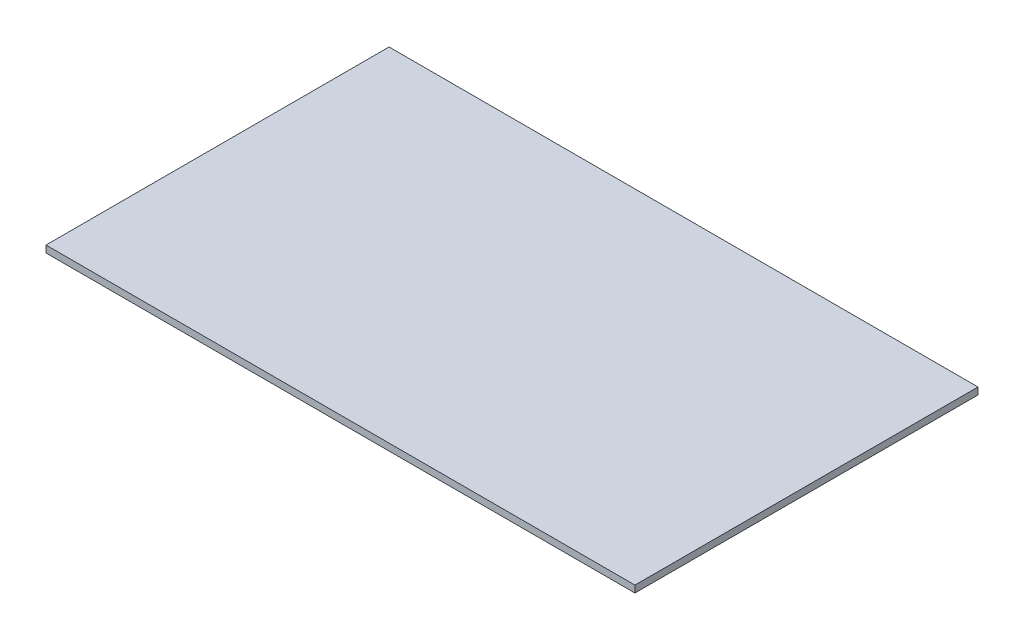
ISO-10303-21;
HEADER;
FILE_DESCRIPTION(('STEP AP214'),'2;1');
FILE_NAME('part.step','',(''),(''),'','','');
FILE_SCHEMA(('AUTOMOTIVE_DESIGN { 1 0 10303 214 1 1 1 1 }'));
ENDSEC;
DATA;
#1=APPLICATION_CONTEXT('core data for automotive mechanical design processes');
#2=APPLICATION_PROTOCOL_DEFINITION('international standard','automotive_design',2000,#1);
#3=PRODUCT_CONTEXT('',#1,'mechanical');
#4=PRODUCT('Part','Part','',(#3));
#5=PRODUCT_RELATED_PRODUCT_CATEGORY('part','',(#4));
#6=PRODUCT_DEFINITION_FORMATION('','',#4);
#7=PRODUCT_DEFINITION_CONTEXT('part definition',#1,'design');
#8=PRODUCT_DEFINITION('design','',#6,#7);
#9=PRODUCT_DEFINITION_SHAPE('','',#8);
#10=(LENGTH_UNIT() NAMED_UNIT(*) SI_UNIT(.MILLI.,.METRE.));
#11=(NAMED_UNIT(*) PLANE_ANGLE_UNIT() SI_UNIT($,.RADIAN.));
#12=(NAMED_UNIT(*) SI_UNIT($,.STERADIAN.) SOLID_ANGLE_UNIT());
#13=UNCERTAINTY_MEASURE_WITH_UNIT(LENGTH_MEASURE(1.E-05),#10,'distance_accuracy_value','');
#14=(GEOMETRIC_REPRESENTATION_CONTEXT(3) GLOBAL_UNCERTAINTY_ASSIGNED_CONTEXT((#13)) GLOBAL_UNIT_ASSIGNED_CONTEXT((#10,
#11,#12)) REPRESENTATION_CONTEXT('',''));
#15=CARTESIAN_POINT('',(0.,0.,0.));
#16=DIRECTION('',(0.,0.,1.));
#17=DIRECTION('',(1.,0.,0.));
#18=AXIS2_PLACEMENT_3D('',#15,#16,#17);
#19=CARTESIAN_POINT('',(0.,0.,149.));
#20=DIRECTION('',(1.,0.,0.));
#21=DIRECTION('',(0.,0.,-1.));
#22=AXIS2_PLACEMENT_3D('',#19,#20,#21);
#23=PLANE('',#22);
#24=DIRECTION('',(0.,-1.,0.));
#25=VECTOR('',#24,1.);
#26=CARTESIAN_POINT('',(0.,0.,0.));
#27=LINE('',#26,#25);
#28=CARTESIAN_POINT('',(0.,3.,0.));
#29=VERTEX_POINT('',#28);
#30=CARTESIAN_POINT('',(0.,0.,0.));
#31=VERTEX_POINT('',#30);
#32=EDGE_CURVE('E113',#29,#31,#27,.T.);
#33=ORIENTED_EDGE('',*,*,#32,.T.);
#34=DIRECTION('',(0.,0.,-1.));
#35=VECTOR('',#34,1.);
#36=CARTESIAN_POINT('',(0.,0.,149.));
#37=LINE('',#36,#35);
#38=CARTESIAN_POINT('',(0.,0.,149.));
#39=VERTEX_POINT('',#38);
#40=EDGE_CURVE('E11',#39,#31,#37,.T.);
#41=ORIENTED_EDGE('',*,*,#40,.F.);
#42=DIRECTION('',(0.,-1.,0.));
#43=VECTOR('',#42,1.);
#44=CARTESIAN_POINT('',(0.,0.,149.));
#45=LINE('',#44,#43);
#46=CARTESIAN_POINT('',(0.,3.,149.));
#47=VERTEX_POINT('',#46);
#48=EDGE_CURVE('E100',#47,#39,#45,.T.);
#49=ORIENTED_EDGE('',*,*,#48,.F.);
#50=DIRECTION('',(0.,0.,-1.));
#51=VECTOR('',#50,1.);
#52=CARTESIAN_POINT('',(0.,3.,149.));
#53=LINE('',#52,#51);
#54=EDGE_CURVE('E112',#47,#29,#53,.T.);
#55=ORIENTED_EDGE('',*,*,#54,.T.);
#56=EDGE_LOOP('',(#33,#41,#49,#55));
#57=FACE_BOUND('',#56,.T.);
#58=ADVANCED_FACE('F44',(#57),#23,.F.);
#59=CARTESIAN_POINT('',(0.,0.,149.));
#60=DIRECTION('',(0.,1.,0.));
#61=DIRECTION('',(0.,0.,1.));
#62=AXIS2_PLACEMENT_3D('',#59,#60,#61);
#63=PLANE('',#62);
#64=DIRECTION('',(1.,0.,0.));
#65=VECTOR('',#64,1.);
#66=CARTESIAN_POINT('',(0.,0.,0.));
#67=LINE('',#66,#65);
#68=CARTESIAN_POINT('',(255.8,0.,0.));
#69=VERTEX_POINT('',#68);
#70=EDGE_CURVE('E105',#31,#69,#67,.T.);
#71=ORIENTED_EDGE('',*,*,#70,.T.);
#72=DIRECTION('',(0.,0.,-1.));
#73=VECTOR('',#72,1.);
#74=CARTESIAN_POINT('',(255.8,0.,149.));
#75=LINE('',#74,#73);
#76=CARTESIAN_POINT('',(255.8,0.,149.));
#77=VERTEX_POINT('',#76);
#78=EDGE_CURVE('E53',#77,#69,#75,.T.);
#79=ORIENTED_EDGE('',*,*,#78,.F.);
#80=DIRECTION('',(1.,0.,0.));
#81=VECTOR('',#80,1.);
#82=CARTESIAN_POINT('',(0.,0.,149.));
#83=LINE('',#82,#81);
#84=EDGE_CURVE('E95',#39,#77,#83,.T.);
#85=ORIENTED_EDGE('',*,*,#84,.F.);
#86=ORIENTED_EDGE('',*,*,#40,.T.);
#87=EDGE_LOOP('',(#71,#79,#85,#86));
#88=FACE_BOUND('',#87,.T.);
#89=ADVANCED_FACE('F101',(#88),#63,.F.);
#90=CARTESIAN_POINT('',(255.8,0.,149.));
#91=DIRECTION('',(-1.,0.,0.));
#92=DIRECTION('',(0.,0.,1.));
#93=AXIS2_PLACEMENT_3D('',#90,#91,#92);
#94=PLANE('',#93);
#95=DIRECTION('',(0.,1.,0.));
#96=VECTOR('',#95,1.);
#97=CARTESIAN_POINT('',(255.8,0.,0.));
#98=LINE('',#97,#96);
#99=CARTESIAN_POINT('',(255.8,3.,0.));
#100=VERTEX_POINT('',#99);
#101=EDGE_CURVE('E80',#69,#100,#98,.T.);
#102=ORIENTED_EDGE('',*,*,#101,.T.);
#103=DIRECTION('',(0.,0.,-1.));
#104=VECTOR('',#103,1.);
#105=CARTESIAN_POINT('',(255.8,3.,149.));
#106=LINE('',#105,#104);
#107=CARTESIAN_POINT('',(255.8,3.,149.));
#108=VERTEX_POINT('',#107);
#109=EDGE_CURVE('E102',#108,#100,#106,.T.);
#110=ORIENTED_EDGE('',*,*,#109,.F.);
#111=DIRECTION('',(0.,1.,0.));
#112=VECTOR('',#111,1.);
#113=CARTESIAN_POINT('',(255.8,0.,149.));
#114=LINE('',#113,#112);
#115=EDGE_CURVE('E92',#77,#108,#114,.T.);
#116=ORIENTED_EDGE('',*,*,#115,.F.);
#117=ORIENTED_EDGE('',*,*,#78,.T.);
#118=EDGE_LOOP('',(#102,#110,#116,#117));
#119=FACE_BOUND('',#118,.T.);
#120=ADVANCED_FACE('F104',(#119),#94,.F.);
#121=CARTESIAN_POINT('',(0.,3.,149.));
#122=DIRECTION('',(0.,-1.,0.));
#123=DIRECTION('',(0.,0.,-1.));
#124=AXIS2_PLACEMENT_3D('',#121,#122,#123);
#125=PLANE('',#124);
#126=DIRECTION('',(-1.,0.,0.));
#127=VECTOR('',#126,1.);
#128=CARTESIAN_POINT('',(0.,3.,0.));
#129=LINE('',#128,#127);
#130=EDGE_CURVE('E84',#100,#29,#129,.T.);
#131=ORIENTED_EDGE('',*,*,#130,.T.);
#132=ORIENTED_EDGE('',*,*,#54,.F.);
#133=DIRECTION('',(-1.,0.,0.));
#134=VECTOR('',#133,1.);
#135=CARTESIAN_POINT('',(0.,3.,149.));
#136=LINE('',#135,#134);
#137=EDGE_CURVE('E64',#108,#47,#136,.T.);
#138=ORIENTED_EDGE('',*,*,#137,.F.);
#139=ORIENTED_EDGE('',*,*,#109,.T.);
#140=EDGE_LOOP('',(#131,#132,#138,#139));
#141=FACE_BOUND('',#140,.T.);
#142=ADVANCED_FACE('F130',(#141),#125,.F.);
#143=CARTESIAN_POINT('',(0.,0.,149.));
#144=DIRECTION('',(0.,0.,-1.));
#145=DIRECTION('',(-1.,0.,0.));
#146=AXIS2_PLACEMENT_3D('',#143,#144,#145);
#147=PLANE('',#146);
#148=ORIENTED_EDGE('',*,*,#48,.T.);
#149=ORIENTED_EDGE('',*,*,#84,.T.);
#150=ORIENTED_EDGE('',*,*,#115,.T.);
#151=ORIENTED_EDGE('',*,*,#137,.T.);
#152=EDGE_LOOP('',(#148,#149,#150,#151));
#153=FACE_BOUND('',#152,.T.);
#154=ADVANCED_FACE('F91',(#153),#147,.F.);
#155=CARTESIAN_POINT('',(0.,0.,0.));
#156=DIRECTION('',(0.,0.,-1.));
#157=DIRECTION('',(-1.,0.,0.));
#158=AXIS2_PLACEMENT_3D('',#155,#156,#157);
#159=PLANE('',#158);
#160=ORIENTED_EDGE('',*,*,#32,.F.);
#161=ORIENTED_EDGE('',*,*,#130,.F.);
#162=ORIENTED_EDGE('',*,*,#101,.F.);
#163=ORIENTED_EDGE('',*,*,#70,.F.);
#164=EDGE_LOOP('',(#160,#161,#162,#163));
#165=FACE_BOUND('',#164,.T.);
#166=ADVANCED_FACE('F128',(#165),#159,.T.);
#167=CLOSED_SHELL('',(#58,#89,#120,#142,#154,#166));
#168=MANIFOLD_SOLID_BREP('B2',#167);
#169=ADVANCED_BREP_SHAPE_REPRESENTATION('',(#18,#168),#14);
#170=SHAPE_DEFINITION_REPRESENTATION(#9,#169);
ENDSEC;
END-ISO-10303-21;
